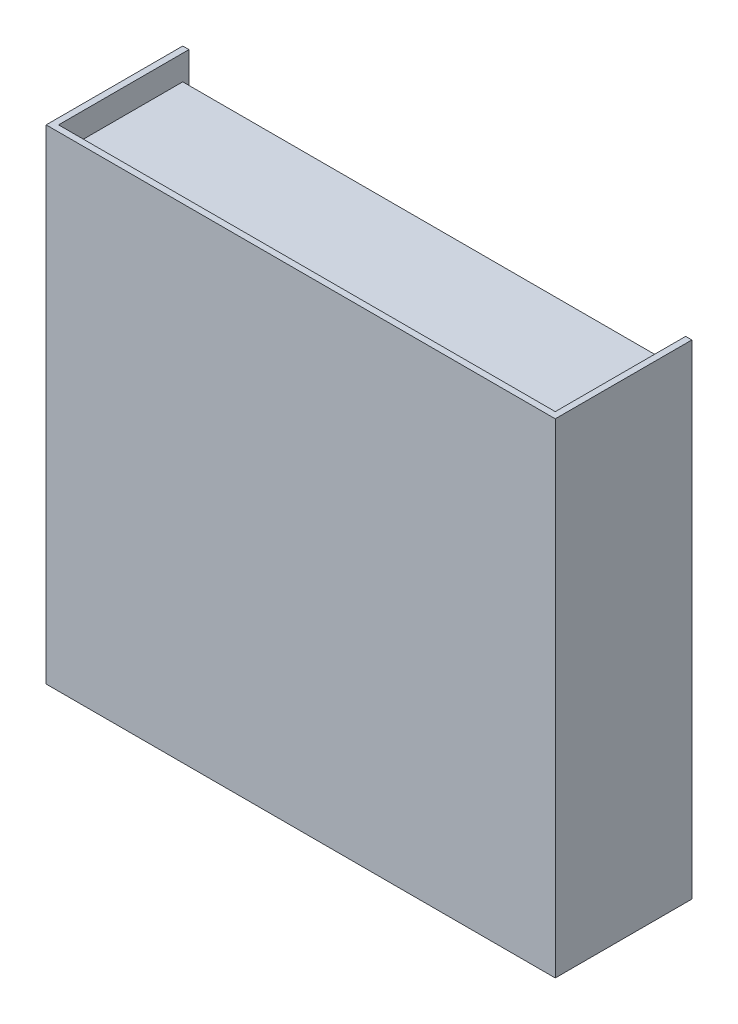
ISO-10303-21;
HEADER;
FILE_DESCRIPTION(('STEP AP214'),'2;1');
FILE_NAME('part.step','',(''),(''),'','','');
FILE_SCHEMA(('AUTOMOTIVE_DESIGN { 1 0 10303 214 1 1 1 1 }'));
ENDSEC;
DATA;
#1=APPLICATION_CONTEXT('core data for automotive mechanical design processes');
#2=APPLICATION_PROTOCOL_DEFINITION('international standard','automotive_design',2000,#1);
#3=PRODUCT_CONTEXT('',#1,'mechanical');
#4=PRODUCT('Part','Part','',(#3));
#5=PRODUCT_RELATED_PRODUCT_CATEGORY('part','',(#4));
#6=PRODUCT_DEFINITION_FORMATION('','',#4);
#7=PRODUCT_DEFINITION_CONTEXT('part definition',#1,'design');
#8=PRODUCT_DEFINITION('design','',#6,#7);
#9=PRODUCT_DEFINITION_SHAPE('','',#8);
#10=(LENGTH_UNIT() NAMED_UNIT(*) SI_UNIT(.MILLI.,.METRE.));
#11=(NAMED_UNIT(*) PLANE_ANGLE_UNIT() SI_UNIT($,.RADIAN.));
#12=(NAMED_UNIT(*) SI_UNIT($,.STERADIAN.) SOLID_ANGLE_UNIT());
#13=UNCERTAINTY_MEASURE_WITH_UNIT(LENGTH_MEASURE(1.E-05),#10,'distance_accuracy_value','');
#14=(GEOMETRIC_REPRESENTATION_CONTEXT(3) GLOBAL_UNCERTAINTY_ASSIGNED_CONTEXT((#13)) GLOBAL_UNIT_ASSIGNED_CONTEXT((#10,
#11,#12)) REPRESENTATION_CONTEXT('',''));
#15=CARTESIAN_POINT('',(0.,0.,0.));
#16=DIRECTION('',(0.,0.,1.));
#17=DIRECTION('',(1.,0.,0.));
#18=AXIS2_PLACEMENT_3D('',#15,#16,#17);
#19=CARTESIAN_POINT('',(-512.899336878687,-463.478806381637,203.2));
#20=DIRECTION('',(-1.,0.,0.));
#21=DIRECTION('',(0.,0.,1.));
#22=AXIS2_PLACEMENT_3D('',#19,#20,#21);
#23=PLANE('',#22);
#24=DIRECTION('',(0.,0.,-1.));
#25=VECTOR('',#24,1.);
#26=CARTESIAN_POINT('',(-512.899336878687,-387.278806381637,203.2));
#27=LINE('',#26,#25);
#28=CARTESIAN_POINT('',(-512.899336878687,-387.278806381637,203.2));
#29=VERTEX_POINT('',#28);
#30=CARTESIAN_POINT('',(-512.899336878687,-387.278806381637,63.5));
#31=VERTEX_POINT('',#30);
#32=EDGE_CURVE('E388',#29,#31,#27,.T.);
#33=ORIENTED_EDGE('',*,*,#32,.T.);
#34=DIRECTION('',(0.,1.,0.));
#35=VECTOR('',#34,1.);
#36=CARTESIAN_POINT('',(-512.899336878687,-399.978806381637,63.5));
#37=LINE('',#36,#35);
#38=CARTESIAN_POINT('',(-512.899336878687,-323.778806381637,63.5));
#39=VERTEX_POINT('',#38);
#40=EDGE_CURVE('E58',#31,#39,#37,.T.);
#41=ORIENTED_EDGE('',*,*,#40,.T.);
#42=DIRECTION('',(0.,0.,-1.));
#43=VECTOR('',#42,1.);
#44=CARTESIAN_POINT('',(-512.899336878687,-323.778806381637,63.5));
#45=LINE('',#44,#43);
#46=CARTESIAN_POINT('',(-512.899336878687,-323.778806381637,50.8));
#47=VERTEX_POINT('',#46);
#48=EDGE_CURVE('E471',#39,#47,#45,.T.);
#49=ORIENTED_EDGE('',*,*,#48,.T.);
#50=DIRECTION('',(0.,1.,0.));
#51=VECTOR('',#50,1.);
#52=CARTESIAN_POINT('',(-512.899336878687,-476.178806381637,50.8));
#53=LINE('',#52,#51);
#54=CARTESIAN_POINT('',(-512.899336878687,-399.978806381637,50.8));
#55=VERTEX_POINT('',#54);
#56=EDGE_CURVE('E66',#55,#47,#53,.T.);
#57=ORIENTED_EDGE('',*,*,#56,.F.);
#58=DIRECTION('',(0.,0.,-1.));
#59=VECTOR('',#58,1.);
#60=CARTESIAN_POINT('',(-512.899336878687,-399.978806381637,203.2));
#61=LINE('',#60,#59);
#62=CARTESIAN_POINT('',(-512.899336878687,-399.978806381637,203.2));
#63=VERTEX_POINT('',#62);
#64=EDGE_CURVE('E312',#63,#55,#61,.T.);
#65=ORIENTED_EDGE('',*,*,#64,.F.);
#66=DIRECTION('',(0.,1.,0.));
#67=VECTOR('',#66,1.);
#68=CARTESIAN_POINT('',(-512.899336878687,-476.178806381637,203.2));
#69=LINE('',#68,#67);
#70=CARTESIAN_POINT('',(-512.899336878687,-476.178806381637,203.2));
#71=VERTEX_POINT('',#70);
#72=EDGE_CURVE('E418',#71,#63,#69,.T.);
#73=ORIENTED_EDGE('',*,*,#72,.F.);
#74=DIRECTION('',(0.,0.,-1.));
#75=VECTOR('',#74,1.);
#76=CARTESIAN_POINT('',(-512.899336878687,-476.178806381637,203.2));
#77=LINE('',#76,#75);
#78=CARTESIAN_POINT('',(-512.899336878687,-476.178806381637,-50.8));
#79=VERTEX_POINT('',#78);
#80=EDGE_CURVE('E430',#71,#79,#77,.T.);
#81=ORIENTED_EDGE('',*,*,#80,.T.);
#82=DIRECTION('',(0.,-1.,0.));
#83=VECTOR('',#82,1.);
#84=CARTESIAN_POINT('',(-512.899336878687,463.621193618363,-50.8));
#85=LINE('',#84,#83);
#86=CARTESIAN_POINT('',(-512.899336878687,514.421193618363,-50.8));
#87=VERTEX_POINT('',#86);
#88=EDGE_CURVE('E328',#87,#79,#85,.T.);
#89=ORIENTED_EDGE('',*,*,#88,.F.);
#90=DIRECTION('',(0.,0.,-1.));
#91=VECTOR('',#90,1.);
#92=CARTESIAN_POINT('',(-512.899336878687,514.421193618363,0.));
#93=LINE('',#92,#91);
#94=CARTESIAN_POINT('',(-512.899336878687,514.421193618363,215.9));
#95=VERTEX_POINT('',#94);
#96=EDGE_CURVE('E275',#95,#87,#93,.T.);
#97=ORIENTED_EDGE('',*,*,#96,.F.);
#98=DIRECTION('',(0.,-1.,0.));
#99=VECTOR('',#98,1.);
#100=CARTESIAN_POINT('',(-512.899336878687,514.421193618363,215.9));
#101=LINE('',#100,#99);
#102=CARTESIAN_POINT('',(-512.899336878687,463.621193618363,215.9));
#103=VERTEX_POINT('',#102);
#104=EDGE_CURVE('E307',#95,#103,#101,.T.);
#105=ORIENTED_EDGE('',*,*,#104,.T.);
#106=DIRECTION('',(0.,0.,-1.));
#107=VECTOR('',#106,1.);
#108=CARTESIAN_POINT('',(-512.899336878687,463.621193618363,0.));
#109=LINE('',#108,#107);
#110=CARTESIAN_POINT('',(-512.899336878687,463.621193618363,-38.1));
#111=VERTEX_POINT('',#110);
#112=EDGE_CURVE('E280',#103,#111,#109,.T.);
#113=ORIENTED_EDGE('',*,*,#112,.T.);
#114=DIRECTION('',(0.,1.,0.));
#115=VECTOR('',#114,1.);
#116=CARTESIAN_POINT('',(-512.899336878687,463.621193618363,-38.1));
#117=LINE('',#116,#115);
#118=CARTESIAN_POINT('',(-512.899336878687,450.921193618363,-38.1));
#119=VERTEX_POINT('',#118);
#120=EDGE_CURVE('E255',#119,#111,#117,.T.);
#121=ORIENTED_EDGE('',*,*,#120,.F.);
#122=DIRECTION('',(0.,0.,-1.));
#123=VECTOR('',#122,1.);
#124=CARTESIAN_POINT('',(-512.899336878687,450.921193618363,203.2));
#125=LINE('',#124,#123);
#126=CARTESIAN_POINT('',(-512.899336878687,450.921193618363,203.2));
#127=VERTEX_POINT('',#126);
#128=EDGE_CURVE('E412',#127,#119,#125,.T.);
#129=ORIENTED_EDGE('',*,*,#128,.F.);
#130=DIRECTION('',(0.,-1.,0.));
#131=VECTOR('',#130,1.);
#132=CARTESIAN_POINT('',(-512.899336878687,38.1711936183629,203.2));
#133=LINE('',#132,#131);
#134=CARTESIAN_POINT('',(-512.899336878687,38.1711936183629,203.2));
#135=VERTEX_POINT('',#134);
#136=EDGE_CURVE('E399',#127,#135,#133,.T.);
#137=ORIENTED_EDGE('',*,*,#136,.T.);
#138=DIRECTION('',(0.,0.,-1.));
#139=VECTOR('',#138,1.);
#140=CARTESIAN_POINT('',(-512.899336878687,38.1711936183629,203.2));
#141=LINE('',#140,#139);
#142=CARTESIAN_POINT('',(-512.899336878687,38.1711936183629,63.5));
#143=VERTEX_POINT('',#142);
#144=EDGE_CURVE('E232',#135,#143,#141,.T.);
#145=ORIENTED_EDGE('',*,*,#144,.T.);
#146=DIRECTION('',(0.,1.,0.));
#147=VECTOR('',#146,1.);
#148=CARTESIAN_POINT('',(-512.899336878687,25.4711936183629,63.5));
#149=LINE('',#148,#147);
#150=CARTESIAN_POINT('',(-512.899336878687,101.671193618363,63.5));
#151=VERTEX_POINT('',#150);
#152=EDGE_CURVE('E223',#143,#151,#149,.T.);
#153=ORIENTED_EDGE('',*,*,#152,.T.);
#154=DIRECTION('',(0.,0.,-1.));
#155=VECTOR('',#154,1.);
#156=CARTESIAN_POINT('',(-512.899336878687,101.671193618363,63.5));
#157=LINE('',#156,#155);
#158=CARTESIAN_POINT('',(-512.899336878687,101.671193618363,50.8));
#159=VERTEX_POINT('',#158);
#160=EDGE_CURVE('E208',#151,#159,#157,.T.);
#161=ORIENTED_EDGE('',*,*,#160,.T.);
#162=CARTESIAN_POINT('',(-512.899336878687,25.471193618363,50.8));
#163=VERTEX_POINT('',#162);
#164=EDGE_CURVE('E263',#163,#159,#53,.T.);
#165=ORIENTED_EDGE('',*,*,#164,.F.);
#166=DIRECTION('',(0.,0.,-1.));
#167=VECTOR('',#166,1.);
#168=CARTESIAN_POINT('',(-512.899336878687,25.4711936183629,203.2));
#169=LINE('',#168,#167);
#170=CARTESIAN_POINT('',(-512.899336878687,25.4711936183629,203.2));
#171=VERTEX_POINT('',#170);
#172=EDGE_CURVE('E378',#171,#163,#169,.T.);
#173=ORIENTED_EDGE('',*,*,#172,.F.);
#174=DIRECTION('',(0.,-1.,0.));
#175=VECTOR('',#174,1.);
#176=CARTESIAN_POINT('',(-512.899336878687,-387.278806381637,203.2));
#177=LINE('',#176,#175);
#178=EDGE_CURVE('E359',#171,#29,#177,.T.);
#179=ORIENTED_EDGE('',*,*,#178,.T.);
#180=EDGE_LOOP('',(#33,#41,#49,#57,#65,#73,#81,#89,#97,#105,#113,#121,#129,#137,#145,#153,#161,
#165,#173,#179));
#181=FACE_BOUND('',#180,.T.);
#182=ADVANCED_FACE('F43',(#181),#23,.F.);
#183=CARTESIAN_POINT('',(503.100663121313,-463.478806381637,203.2));
#184=DIRECTION('',(1.,0.,0.));
#185=DIRECTION('',(0.,0.,-1.));
#186=AXIS2_PLACEMENT_3D('',#183,#184,#185);
#187=PLANE('',#186);
#188=DIRECTION('',(0.,0.,-1.));
#189=VECTOR('',#188,1.);
#190=CARTESIAN_POINT('',(503.100663121313,-323.778806381637,63.5));
#191=LINE('',#190,#189);
#192=CARTESIAN_POINT('',(503.100663121313,-323.778806381637,63.5));
#193=VERTEX_POINT('',#192);
#194=CARTESIAN_POINT('',(503.100663121313,-323.778806381637,50.8));
#195=VERTEX_POINT('',#194);
#196=EDGE_CURVE('E476',#193,#195,#191,.T.);
#197=ORIENTED_EDGE('',*,*,#196,.F.);
#198=DIRECTION('',(0.,-1.,0.));
#199=VECTOR('',#198,1.);
#200=CARTESIAN_POINT('',(503.100663121313,-399.978806381637,63.5));
#201=LINE('',#200,#199);
#202=CARTESIAN_POINT('',(503.100663121313,-387.278806381637,63.5));
#203=VERTEX_POINT('',#202);
#204=EDGE_CURVE('E464',#193,#203,#201,.T.);
#205=ORIENTED_EDGE('',*,*,#204,.T.);
#206=DIRECTION('',(0.,0.,-1.));
#207=VECTOR('',#206,1.);
#208=CARTESIAN_POINT('',(503.100663121313,-387.278806381637,203.2));
#209=LINE('',#208,#207);
#210=CARTESIAN_POINT('',(503.100663121313,-387.278806381637,203.2));
#211=VERTEX_POINT('',#210);
#212=EDGE_CURVE('E384',#211,#203,#209,.T.);
#213=ORIENTED_EDGE('',*,*,#212,.F.);
#214=DIRECTION('',(0.,1.,0.));
#215=VECTOR('',#214,1.);
#216=CARTESIAN_POINT('',(503.100663121313,-387.278806381637,203.2));
#217=LINE('',#216,#215);
#218=CARTESIAN_POINT('',(503.100663121313,25.4711936183629,203.2));
#219=VERTEX_POINT('',#218);
#220=EDGE_CURVE('E370',#211,#219,#217,.T.);
#221=ORIENTED_EDGE('',*,*,#220,.T.);
#222=DIRECTION('',(0.,0.,-1.));
#223=VECTOR('',#222,1.);
#224=CARTESIAN_POINT('',(503.100663121313,25.4711936183629,203.2));
#225=LINE('',#224,#223);
#226=CARTESIAN_POINT('',(503.100663121313,25.4711936183629,50.8));
#227=VERTEX_POINT('',#226);
#228=EDGE_CURVE('E381',#219,#227,#225,.T.);
#229=ORIENTED_EDGE('',*,*,#228,.T.);
#230=DIRECTION('',(0.,-1.,0.));
#231=VECTOR('',#230,1.);
#232=CARTESIAN_POINT('',(503.100663121313,-476.178806381637,50.8));
#233=LINE('',#232,#231);
#234=CARTESIAN_POINT('',(503.100663121313,101.671193618363,50.8));
#235=VERTEX_POINT('',#234);
#236=EDGE_CURVE('E266',#235,#227,#233,.T.);
#237=ORIENTED_EDGE('',*,*,#236,.F.);
#238=DIRECTION('',(0.,0.,-1.));
#239=VECTOR('',#238,1.);
#240=CARTESIAN_POINT('',(503.100663121313,101.671193618363,63.5));
#241=LINE('',#240,#239);
#242=CARTESIAN_POINT('',(503.100663121313,101.671193618363,63.5));
#243=VERTEX_POINT('',#242);
#244=EDGE_CURVE('E219',#243,#235,#241,.T.);
#245=ORIENTED_EDGE('',*,*,#244,.F.);
#246=DIRECTION('',(0.,-1.,0.));
#247=VECTOR('',#246,1.);
#248=CARTESIAN_POINT('',(503.100663121313,25.4711936183629,63.5));
#249=LINE('',#248,#247);
#250=CARTESIAN_POINT('',(503.100663121313,38.1711936183629,63.5));
#251=VERTEX_POINT('',#250);
#252=EDGE_CURVE('E226',#243,#251,#249,.T.);
#253=ORIENTED_EDGE('',*,*,#252,.T.);
#254=DIRECTION('',(0.,0.,-1.));
#255=VECTOR('',#254,1.);
#256=CARTESIAN_POINT('',(503.100663121313,38.1711936183629,203.2));
#257=LINE('',#256,#255);
#258=CARTESIAN_POINT('',(503.100663121313,38.1711936183629,203.2));
#259=VERTEX_POINT('',#258);
#260=EDGE_CURVE('E406',#259,#251,#257,.T.);
#261=ORIENTED_EDGE('',*,*,#260,.F.);
#262=DIRECTION('',(0.,1.,0.));
#263=VECTOR('',#262,1.);
#264=CARTESIAN_POINT('',(503.100663121313,38.1711936183629,203.2));
#265=LINE('',#264,#263);
#266=CARTESIAN_POINT('',(503.100663121313,450.921193618363,203.2));
#267=VERTEX_POINT('',#266);
#268=EDGE_CURVE('E391',#259,#267,#265,.T.);
#269=ORIENTED_EDGE('',*,*,#268,.T.);
#270=DIRECTION('',(0.,0.,-1.));
#271=VECTOR('',#270,1.);
#272=CARTESIAN_POINT('',(503.100663121313,450.921193618363,203.2));
#273=LINE('',#272,#271);
#274=CARTESIAN_POINT('',(503.100663121313,450.921193618363,-38.1));
#275=VERTEX_POINT('',#274);
#276=EDGE_CURVE('E415',#267,#275,#273,.T.);
#277=ORIENTED_EDGE('',*,*,#276,.T.);
#278=DIRECTION('',(0.,-1.,0.));
#279=VECTOR('',#278,1.);
#280=CARTESIAN_POINT('',(503.100663121313,463.621193618363,-38.1));
#281=LINE('',#280,#279);
#282=CARTESIAN_POINT('',(503.100663121313,463.621193618363,-38.1));
#283=VERTEX_POINT('',#282);
#284=EDGE_CURVE('E247',#283,#275,#281,.T.);
#285=ORIENTED_EDGE('',*,*,#284,.F.);
#286=DIRECTION('',(0.,0.,1.));
#287=VECTOR('',#286,1.);
#288=CARTESIAN_POINT('',(503.100663121313,463.621193618363,0.));
#289=LINE('',#288,#287);
#290=CARTESIAN_POINT('',(503.100663121313,463.621193618363,215.9));
#291=VERTEX_POINT('',#290);
#292=EDGE_CURVE('E308',#283,#291,#289,.T.);
#293=ORIENTED_EDGE('',*,*,#292,.T.);
#294=DIRECTION('',(0.,-1.,0.));
#295=VECTOR('',#294,1.);
#296=CARTESIAN_POINT('',(503.100663121313,514.421193618363,215.9));
#297=LINE('',#296,#295);
#298=CARTESIAN_POINT('',(503.100663121313,514.421193618363,215.9));
#299=VERTEX_POINT('',#298);
#300=EDGE_CURVE('E321',#299,#291,#297,.T.);
#301=ORIENTED_EDGE('',*,*,#300,.F.);
#302=DIRECTION('',(0.,0.,1.));
#303=VECTOR('',#302,1.);
#304=CARTESIAN_POINT('',(503.100663121313,514.421193618363,-50.8));
#305=LINE('',#304,#303);
#306=CARTESIAN_POINT('',(503.100663121313,514.421193618363,-50.8));
#307=VERTEX_POINT('',#306);
#308=EDGE_CURVE('E300',#307,#299,#305,.T.);
#309=ORIENTED_EDGE('',*,*,#308,.F.);
#310=DIRECTION('',(0.,1.,0.));
#311=VECTOR('',#310,1.);
#312=CARTESIAN_POINT('',(503.100663121313,463.621193618363,-50.8));
#313=LINE('',#312,#311);
#314=CARTESIAN_POINT('',(503.100663121313,-476.178806381637,-50.8));
#315=VERTEX_POINT('',#314);
#316=EDGE_CURVE('E344',#315,#307,#313,.T.);
#317=ORIENTED_EDGE('',*,*,#316,.F.);
#318=DIRECTION('',(0.,0.,-1.));
#319=VECTOR('',#318,1.);
#320=CARTESIAN_POINT('',(503.100663121313,-476.178806381637,203.2));
#321=LINE('',#320,#319);
#322=CARTESIAN_POINT('',(503.100663121313,-476.178806381637,203.2));
#323=VERTEX_POINT('',#322);
#324=EDGE_CURVE('E439',#323,#315,#321,.T.);
#325=ORIENTED_EDGE('',*,*,#324,.F.);
#326=DIRECTION('',(0.,-1.,0.));
#327=VECTOR('',#326,1.);
#328=CARTESIAN_POINT('',(503.100663121313,-463.478806381637,203.2));
#329=LINE('',#328,#327);
#330=CARTESIAN_POINT('',(503.100663121313,-399.978806381637,203.2));
#331=VERTEX_POINT('',#330);
#332=EDGE_CURVE('E426',#331,#323,#329,.T.);
#333=ORIENTED_EDGE('',*,*,#332,.F.);
#334=DIRECTION('',(0.,0.,-1.));
#335=VECTOR('',#334,1.);
#336=CARTESIAN_POINT('',(503.100663121313,-399.978806381637,203.2));
#337=LINE('',#336,#335);
#338=CARTESIAN_POINT('',(503.100663121313,-399.978806381637,50.8));
#339=VERTEX_POINT('',#338);
#340=EDGE_CURVE('E442',#331,#339,#337,.T.);
#341=ORIENTED_EDGE('',*,*,#340,.T.);
#342=EDGE_CURVE('E271',#195,#339,#233,.T.);
#343=ORIENTED_EDGE('',*,*,#342,.F.);
#344=EDGE_LOOP('',(#197,#205,#213,#221,#229,#237,#245,#253,#261,#269,#277,#285,#293,#301,#309,
#317,#325,#333,#341,#343));
#345=FACE_BOUND('',#344,.T.);
#346=ADVANCED_FACE('F523',(#345),#187,.F.);
#347=CARTESIAN_POINT('',(-512.899336878687,-399.978806381637,203.2));
#348=DIRECTION('',(0.,1.,0.));
#349=DIRECTION('',(0.,0.,1.));
#350=AXIS2_PLACEMENT_3D('',#347,#348,#349);
#351=PLANE('',#350);
#352=ORIENTED_EDGE('',*,*,#64,.T.);
#353=DIRECTION('',(-1.,0.,0.));
#354=VECTOR('',#353,1.);
#355=CARTESIAN_POINT('',(-512.899336878687,-399.978806381637,50.8));
#356=LINE('',#355,#354);
#357=EDGE_CURVE('E270',#339,#55,#356,.T.);
#358=ORIENTED_EDGE('',*,*,#357,.F.);
#359=ORIENTED_EDGE('',*,*,#340,.F.);
#360=DIRECTION('',(1.,0.,0.));
#361=VECTOR('',#360,1.);
#362=CARTESIAN_POINT('',(-512.899336878687,-399.978806381637,203.2));
#363=LINE('',#362,#361);
#364=EDGE_CURVE('E422',#63,#331,#363,.T.);
#365=ORIENTED_EDGE('',*,*,#364,.F.);
#366=EDGE_LOOP('',(#352,#358,#359,#365));
#367=FACE_BOUND('',#366,.T.);
#368=ADVANCED_FACE('F490',(#367),#351,.F.);
#369=CARTESIAN_POINT('',(-512.899336878687,38.1711936183629,203.2));
#370=DIRECTION('',(0.,1.,0.));
#371=DIRECTION('',(0.,0.,1.));
#372=AXIS2_PLACEMENT_3D('',#369,#370,#371);
#373=PLANE('',#372);
#374=DIRECTION('',(1.,0.,0.));
#375=VECTOR('',#374,1.);
#376=CARTESIAN_POINT('',(-512.899336878687,38.1711936183629,63.5));
#377=LINE('',#376,#375);
#378=EDGE_CURVE('E243',#143,#251,#377,.T.);
#379=ORIENTED_EDGE('',*,*,#378,.F.);
#380=ORIENTED_EDGE('',*,*,#144,.F.);
#381=DIRECTION('',(1.,0.,0.));
#382=VECTOR('',#381,1.);
#383=CARTESIAN_POINT('',(-512.899336878687,38.1711936183629,203.2));
#384=LINE('',#383,#382);
#385=EDGE_CURVE('E402',#135,#259,#384,.T.);
#386=ORIENTED_EDGE('',*,*,#385,.T.);
#387=ORIENTED_EDGE('',*,*,#260,.T.);
#388=EDGE_LOOP('',(#379,#380,#386,#387));
#389=FACE_BOUND('',#388,.T.);
#390=ADVANCED_FACE('F545',(#389),#373,.T.);
#391=CARTESIAN_POINT('',(-512.899336878687,-387.278806381637,203.2));
#392=DIRECTION('',(0.,1.,0.));
#393=DIRECTION('',(0.,0.,1.));
#394=AXIS2_PLACEMENT_3D('',#391,#392,#393);
#395=PLANE('',#394);
#396=DIRECTION('',(1.,0.,0.));
#397=VECTOR('',#396,1.);
#398=CARTESIAN_POINT('',(-512.899336878687,-387.278806381637,63.5));
#399=LINE('',#398,#397);
#400=EDGE_CURVE('E11',#31,#203,#399,.T.);
#401=ORIENTED_EDGE('',*,*,#400,.F.);
#402=ORIENTED_EDGE('',*,*,#32,.F.);
#403=DIRECTION('',(1.,0.,0.));
#404=VECTOR('',#403,1.);
#405=CARTESIAN_POINT('',(-512.899336878687,-387.278806381637,203.2));
#406=LINE('',#405,#404);
#407=EDGE_CURVE('E366',#29,#211,#406,.T.);
#408=ORIENTED_EDGE('',*,*,#407,.T.);
#409=ORIENTED_EDGE('',*,*,#212,.T.);
#410=EDGE_LOOP('',(#401,#402,#408,#409));
#411=FACE_BOUND('',#410,.T.);
#412=ADVANCED_FACE('F458',(#411),#395,.T.);
#413=CARTESIAN_POINT('',(-512.899336878687,25.4711936183629,203.2));
#414=DIRECTION('',(0.,-1.,0.));
#415=DIRECTION('',(0.,0.,-1.));
#416=AXIS2_PLACEMENT_3D('',#413,#414,#415);
#417=PLANE('',#416);
#418=ORIENTED_EDGE('',*,*,#172,.T.);
#419=DIRECTION('',(1.,0.,0.));
#420=VECTOR('',#419,1.);
#421=CARTESIAN_POINT('',(-512.899336878687,25.4711936183629,50.8));
#422=LINE('',#421,#420);
#423=EDGE_CURVE('E51',#163,#227,#422,.T.);
#424=ORIENTED_EDGE('',*,*,#423,.T.);
#425=ORIENTED_EDGE('',*,*,#228,.F.);
#426=DIRECTION('',(-1.,0.,0.));
#427=VECTOR('',#426,1.);
#428=CARTESIAN_POINT('',(-512.899336878687,25.4711936183629,203.2));
#429=LINE('',#428,#427);
#430=EDGE_CURVE('E374',#219,#171,#429,.T.);
#431=ORIENTED_EDGE('',*,*,#430,.T.);
#432=EDGE_LOOP('',(#418,#424,#425,#431));
#433=FACE_BOUND('',#432,.T.);
#434=ADVANCED_FACE('F451',(#433),#417,.T.);
#435=CARTESIAN_POINT('',(-525.599336878687,463.621193618363,203.2));
#436=DIRECTION('',(0.,-1.,0.));
#437=DIRECTION('',(0.,0.,-1.));
#438=AXIS2_PLACEMENT_3D('',#435,#436,#437);
#439=PLANE('',#438);
#440=ORIENTED_EDGE('',*,*,#112,.F.);
#441=DIRECTION('',(-1.,0.,0.));
#442=VECTOR('',#441,1.);
#443=CARTESIAN_POINT('',(-512.899336878687,463.621193618363,215.9));
#444=LINE('',#443,#442);
#445=EDGE_CURVE('E274',#291,#103,#444,.T.);
#446=ORIENTED_EDGE('',*,*,#445,.F.);
#447=ORIENTED_EDGE('',*,*,#292,.F.);
#448=DIRECTION('',(1.,0.,0.));
#449=VECTOR('',#448,1.);
#450=CARTESIAN_POINT('',(503.100663121313,463.621193618363,-38.1));
#451=LINE('',#450,#449);
#452=EDGE_CURVE('E259',#111,#283,#451,.T.);
#453=ORIENTED_EDGE('',*,*,#452,.F.);
#454=EDGE_LOOP('',(#440,#446,#447,#453));
#455=FACE_BOUND('',#454,.T.);
#456=ADVANCED_FACE('F536',(#455),#439,.F.);
#457=CARTESIAN_POINT('',(515.800663121313,-476.178806381637,203.2));
#458=DIRECTION('',(-1.,0.,0.));
#459=DIRECTION('',(0.,0.,1.));
#460=AXIS2_PLACEMENT_3D('',#457,#458,#459);
#461=PLANE('',#460);
#462=DIRECTION('',(0.,0.,-1.));
#463=VECTOR('',#462,1.);
#464=CARTESIAN_POINT('',(515.800663121313,-476.178806381637,203.2));
#465=LINE('',#464,#463);
#466=CARTESIAN_POINT('',(515.800663121313,-476.178806381637,228.6));
#467=VERTEX_POINT('',#466);
#468=CARTESIAN_POINT('',(515.800663121313,-476.178806381637,-50.8));
#469=VERTEX_POINT('',#468);
#470=EDGE_CURVE('E436',#467,#469,#465,.T.);
#471=ORIENTED_EDGE('',*,*,#470,.T.);
#472=DIRECTION('',(0.,-1.,0.));
#473=VECTOR('',#472,1.);
#474=CARTESIAN_POINT('',(515.800663121313,463.621193618363,-50.8));
#475=LINE('',#474,#473);
#476=CARTESIAN_POINT('',(515.800663121313,514.421193618363,-50.8));
#477=VERTEX_POINT('',#476);
#478=EDGE_CURVE('E336',#477,#469,#475,.T.);
#479=ORIENTED_EDGE('',*,*,#478,.F.);
#480=DIRECTION('',(0.,0.,-1.));
#481=VECTOR('',#480,1.);
#482=CARTESIAN_POINT('',(515.800663121313,514.421193618363,228.6));
#483=LINE('',#482,#481);
#484=CARTESIAN_POINT('',(515.800663121313,514.421193618363,228.6));
#485=VERTEX_POINT('',#484);
#486=EDGE_CURVE('E292',#485,#477,#483,.T.);
#487=ORIENTED_EDGE('',*,*,#486,.F.);
#488=DIRECTION('',(0.,1.,0.));
#489=VECTOR('',#488,1.);
#490=CARTESIAN_POINT('',(515.800663121313,463.621193618363,228.6));
#491=LINE('',#490,#489);
#492=EDGE_CURVE('E356',#467,#485,#491,.T.);
#493=ORIENTED_EDGE('',*,*,#492,.F.);
#494=EDGE_LOOP('',(#471,#479,#487,#493));
#495=FACE_BOUND('',#494,.T.);
#496=ADVANCED_FACE('F517',(#495),#461,.F.);
#497=CARTESIAN_POINT('',(-525.599336878687,-476.178806381637,203.2));
#498=DIRECTION('',(1.,0.,0.));
#499=DIRECTION('',(0.,0.,-1.));
#500=AXIS2_PLACEMENT_3D('',#497,#498,#499);
#501=PLANE('',#500);
#502=DIRECTION('',(0.,-1.,0.));
#503=VECTOR('',#502,1.);
#504=CARTESIAN_POINT('',(-525.599336878687,463.621193618363,228.6));
#505=LINE('',#504,#503);
#506=CARTESIAN_POINT('',(-525.599336878687,514.421193618363,228.6));
#507=VERTEX_POINT('',#506);
#508=CARTESIAN_POINT('',(-525.599336878687,-476.178806381637,228.6));
#509=VERTEX_POINT('',#508);
#510=EDGE_CURVE('E348',#507,#509,#505,.T.);
#511=ORIENTED_EDGE('',*,*,#510,.F.);
#512=DIRECTION('',(0.,0.,1.));
#513=VECTOR('',#512,1.);
#514=CARTESIAN_POINT('',(-525.599336878687,514.421193618363,-50.8));
#515=LINE('',#514,#513);
#516=CARTESIAN_POINT('',(-525.599336878687,514.421193618363,-50.8));
#517=VERTEX_POINT('',#516);
#518=EDGE_CURVE('E284',#517,#507,#515,.T.);
#519=ORIENTED_EDGE('',*,*,#518,.F.);
#520=DIRECTION('',(0.,1.,0.));
#521=VECTOR('',#520,1.);
#522=CARTESIAN_POINT('',(-525.599336878687,463.621193618363,-50.8));
#523=LINE('',#522,#521);
#524=CARTESIAN_POINT('',(-525.599336878687,-476.178806381637,-50.8));
#525=VERTEX_POINT('',#524);
#526=EDGE_CURVE('E325',#525,#517,#523,.T.);
#527=ORIENTED_EDGE('',*,*,#526,.F.);
#528=DIRECTION('',(0.,0.,-1.));
#529=VECTOR('',#528,1.);
#530=CARTESIAN_POINT('',(-525.599336878687,-476.178806381637,203.2));
#531=LINE('',#530,#529);
#532=EDGE_CURVE('E433',#509,#525,#531,.T.);
#533=ORIENTED_EDGE('',*,*,#532,.F.);
#534=EDGE_LOOP('',(#511,#519,#527,#533));
#535=FACE_BOUND('',#534,.T.);
#536=ADVANCED_FACE('F508',(#535),#501,.F.);
#537=CARTESIAN_POINT('',(-525.599336878687,-476.178806381637,203.2));
#538=DIRECTION('',(0.,1.,0.));
#539=DIRECTION('',(0.,0.,1.));
#540=AXIS2_PLACEMENT_3D('',#537,#538,#539);
#541=PLANE('',#540);
#542=ORIENTED_EDGE('',*,*,#532,.T.);
#543=DIRECTION('',(-1.,0.,0.));
#544=VECTOR('',#543,1.);
#545=CARTESIAN_POINT('',(-525.599336878687,-476.178806381637,-50.8));
#546=LINE('',#545,#544);
#547=EDGE_CURVE('E332',#79,#525,#546,.T.);
#548=ORIENTED_EDGE('',*,*,#547,.F.);
#549=ORIENTED_EDGE('',*,*,#80,.F.);
#550=DIRECTION('',(1.,0.,0.));
#551=VECTOR('',#550,1.);
#552=CARTESIAN_POINT('',(-525.599336878687,-476.178806381637,203.2));
#553=LINE('',#552,#551);
#554=EDGE_CURVE('E347',#71,#323,#553,.T.);
#555=ORIENTED_EDGE('',*,*,#554,.T.);
#556=ORIENTED_EDGE('',*,*,#324,.T.);
#557=DIRECTION('',(-1.,0.,0.));
#558=VECTOR('',#557,1.);
#559=CARTESIAN_POINT('',(515.800663121313,-476.178806381637,-50.8));
#560=LINE('',#559,#558);
#561=EDGE_CURVE('E340',#469,#315,#560,.T.);
#562=ORIENTED_EDGE('',*,*,#561,.F.);
#563=ORIENTED_EDGE('',*,*,#470,.F.);
#564=DIRECTION('',(1.,0.,0.));
#565=VECTOR('',#564,1.);
#566=CARTESIAN_POINT('',(-525.599336878687,-476.178806381637,228.6));
#567=LINE('',#566,#565);
#568=EDGE_CURVE('E352',#509,#467,#567,.T.);
#569=ORIENTED_EDGE('',*,*,#568,.F.);
#570=EDGE_LOOP('',(#542,#548,#549,#555,#556,#562,#563,#569));
#571=FACE_BOUND('',#570,.T.);
#572=ADVANCED_FACE('F498',(#571),#541,.F.);
#573=CARTESIAN_POINT('',(-512.899336878687,450.921193618363,203.2));
#574=DIRECTION('',(0.,-1.,0.));
#575=DIRECTION('',(0.,0.,-1.));
#576=AXIS2_PLACEMENT_3D('',#573,#574,#575);
#577=PLANE('',#576);
#578=ORIENTED_EDGE('',*,*,#128,.T.);
#579=DIRECTION('',(-1.,0.,0.));
#580=VECTOR('',#579,1.);
#581=CARTESIAN_POINT('',(503.100663121313,450.921193618363,-38.1));
#582=LINE('',#581,#580);
#583=EDGE_CURVE('E251',#275,#119,#582,.T.);
#584=ORIENTED_EDGE('',*,*,#583,.F.);
#585=ORIENTED_EDGE('',*,*,#276,.F.);
#586=DIRECTION('',(-1.,0.,0.));
#587=VECTOR('',#586,1.);
#588=CARTESIAN_POINT('',(-512.899336878687,450.921193618363,203.2));
#589=LINE('',#588,#587);
#590=EDGE_CURVE('E395',#267,#127,#589,.T.);
#591=ORIENTED_EDGE('',*,*,#590,.T.);
#592=EDGE_LOOP('',(#578,#584,#585,#591));
#593=FACE_BOUND('',#592,.T.);
#594=ADVANCED_FACE('F541',(#593),#577,.T.);
#595=CARTESIAN_POINT('',(0.,0.,203.2));
#596=DIRECTION('',(0.,0.,1.));
#597=DIRECTION('',(1.,0.,0.));
#598=AXIS2_PLACEMENT_3D('',#595,#596,#597);
#599=PLANE('',#598);
#600=ORIENTED_EDGE('',*,*,#178,.F.);
#601=ORIENTED_EDGE('',*,*,#430,.F.);
#602=ORIENTED_EDGE('',*,*,#220,.F.);
#603=ORIENTED_EDGE('',*,*,#407,.F.);
#604=EDGE_LOOP('',(#600,#601,#602,#603));
#605=FACE_BOUND('',#604,.T.);
#606=ADVANCED_FACE('F546',(#605),#599,.F.);
#607=CARTESIAN_POINT('',(0.,0.,228.6));
#608=DIRECTION('',(0.,0.,1.));
#609=DIRECTION('',(1.,0.,0.));
#610=AXIS2_PLACEMENT_3D('',#607,#608,#609);
#611=PLANE('',#610);
#612=ORIENTED_EDGE('',*,*,#510,.T.);
#613=ORIENTED_EDGE('',*,*,#568,.T.);
#614=ORIENTED_EDGE('',*,*,#492,.T.);
#615=DIRECTION('',(1.,0.,0.));
#616=VECTOR('',#615,1.);
#617=CARTESIAN_POINT('',(515.800663121313,514.421193618363,228.6));
#618=LINE('',#617,#616);
#619=EDGE_CURVE('E288',#507,#485,#618,.T.);
#620=ORIENTED_EDGE('',*,*,#619,.F.);
#621=EDGE_LOOP('',(#612,#613,#614,#620));
#622=FACE_BOUND('',#621,.T.);
#623=ADVANCED_FACE('F514',(#622),#611,.T.);
#624=ORIENTED_EDGE('',*,*,#554,.F.);
#625=ORIENTED_EDGE('',*,*,#72,.T.);
#626=ORIENTED_EDGE('',*,*,#364,.T.);
#627=ORIENTED_EDGE('',*,*,#332,.T.);
#628=EDGE_LOOP('',(#624,#625,#626,#627));
#629=FACE_BOUND('',#628,.T.);
#630=ADVANCED_FACE('F496',(#629),#599,.F.);
#631=ORIENTED_EDGE('',*,*,#268,.F.);
#632=ORIENTED_EDGE('',*,*,#385,.F.);
#633=ORIENTED_EDGE('',*,*,#136,.F.);
#634=ORIENTED_EDGE('',*,*,#590,.F.);
#635=EDGE_LOOP('',(#631,#632,#633,#634));
#636=FACE_BOUND('',#635,.T.);
#637=ADVANCED_FACE('F543',(#636),#599,.F.);
#638=CARTESIAN_POINT('',(0.,0.,-50.8));
#639=DIRECTION('',(0.,0.,-1.));
#640=DIRECTION('',(-1.,0.,0.));
#641=AXIS2_PLACEMENT_3D('',#638,#639,#640);
#642=PLANE('',#641);
#643=ORIENTED_EDGE('',*,*,#478,.T.);
#644=ORIENTED_EDGE('',*,*,#561,.T.);
#645=ORIENTED_EDGE('',*,*,#316,.T.);
#646=DIRECTION('',(-1.,0.,0.));
#647=VECTOR('',#646,1.);
#648=CARTESIAN_POINT('',(515.800663121313,514.421193618363,-50.8));
#649=LINE('',#648,#647);
#650=EDGE_CURVE('E296',#477,#307,#649,.T.);
#651=ORIENTED_EDGE('',*,*,#650,.F.);
#652=EDGE_LOOP('',(#643,#644,#645,#651));
#653=FACE_BOUND('',#652,.T.);
#654=ADVANCED_FACE('F521',(#653),#642,.T.);
#655=CARTESIAN_POINT('',(0.,0.,-50.8));
#656=DIRECTION('',(0.,0.,1.));
#657=DIRECTION('',(1.,0.,0.));
#658=AXIS2_PLACEMENT_3D('',#655,#656,#657);
#659=PLANE('',#658);
#660=ORIENTED_EDGE('',*,*,#526,.T.);
#661=DIRECTION('',(-1.,0.,0.));
#662=VECTOR('',#661,1.);
#663=CARTESIAN_POINT('',(-512.899336878687,514.421193618363,-50.8));
#664=LINE('',#663,#662);
#665=EDGE_CURVE('E279',#87,#517,#664,.T.);
#666=ORIENTED_EDGE('',*,*,#665,.F.);
#667=ORIENTED_EDGE('',*,*,#88,.T.);
#668=ORIENTED_EDGE('',*,*,#547,.T.);
#669=EDGE_LOOP('',(#660,#666,#667,#668));
#670=FACE_BOUND('',#669,.T.);
#671=ADVANCED_FACE('F504',(#670),#659,.F.);
#672=CARTESIAN_POINT('',(-512.899336878687,514.421193618363,215.9));
#673=DIRECTION('',(0.,0.,1.));
#674=DIRECTION('',(1.,0.,0.));
#675=AXIS2_PLACEMENT_3D('',#672,#673,#674);
#676=PLANE('',#675);
#677=ORIENTED_EDGE('',*,*,#445,.T.);
#678=ORIENTED_EDGE('',*,*,#104,.F.);
#679=DIRECTION('',(-1.,0.,0.));
#680=VECTOR('',#679,1.);
#681=CARTESIAN_POINT('',(-512.899336878687,514.421193618363,215.9));
#682=LINE('',#681,#680);
#683=EDGE_CURVE('E303',#299,#95,#682,.T.);
#684=ORIENTED_EDGE('',*,*,#683,.F.);
#685=ORIENTED_EDGE('',*,*,#300,.T.);
#686=EDGE_LOOP('',(#677,#678,#684,#685));
#687=FACE_BOUND('',#686,.T.);
#688=ADVANCED_FACE('F528',(#687),#676,.F.);
#689=CARTESIAN_POINT('',(0.,514.421193618363,0.));
#690=DIRECTION('',(0.,1.,0.));
#691=DIRECTION('',(0.,0.,1.));
#692=AXIS2_PLACEMENT_3D('',#689,#690,#691);
#693=PLANE('',#692);
#694=ORIENTED_EDGE('',*,*,#96,.T.);
#695=ORIENTED_EDGE('',*,*,#665,.T.);
#696=ORIENTED_EDGE('',*,*,#518,.T.);
#697=ORIENTED_EDGE('',*,*,#619,.T.);
#698=ORIENTED_EDGE('',*,*,#486,.T.);
#699=ORIENTED_EDGE('',*,*,#650,.T.);
#700=ORIENTED_EDGE('',*,*,#308,.T.);
#701=ORIENTED_EDGE('',*,*,#683,.T.);
#702=EDGE_LOOP('',(#694,#695,#696,#697,#698,#699,#700,#701));
#703=FACE_BOUND('',#702,.T.);
#704=ADVANCED_FACE('F511',(#703),#693,.T.);
#705=CARTESIAN_POINT('',(0.,0.,50.8));
#706=DIRECTION('',(0.,0.,-1.));
#707=DIRECTION('',(-1.,0.,0.));
#708=AXIS2_PLACEMENT_3D('',#705,#706,#707);
#709=PLANE('',#708);
#710=ORIENTED_EDGE('',*,*,#164,.T.);
#711=DIRECTION('',(1.,0.,0.));
#712=VECTOR('',#711,1.);
#713=CARTESIAN_POINT('',(503.100663121313,101.671193618363,50.8));
#714=LINE('',#713,#712);
#715=EDGE_CURVE('E215',#159,#235,#714,.T.);
#716=ORIENTED_EDGE('',*,*,#715,.T.);
#717=ORIENTED_EDGE('',*,*,#236,.T.);
#718=ORIENTED_EDGE('',*,*,#423,.F.);
#719=EDGE_LOOP('',(#710,#716,#717,#718));
#720=FACE_BOUND('',#719,.T.);
#721=ADVANCED_FACE('F454',(#720),#709,.T.);
#722=ORIENTED_EDGE('',*,*,#357,.T.);
#723=ORIENTED_EDGE('',*,*,#56,.T.);
#724=DIRECTION('',(1.,0.,0.));
#725=VECTOR('',#724,1.);
#726=CARTESIAN_POINT('',(503.100663121313,-323.778806381637,50.8));
#727=LINE('',#726,#725);
#728=EDGE_CURVE('E241',#47,#195,#727,.T.);
#729=ORIENTED_EDGE('',*,*,#728,.T.);
#730=ORIENTED_EDGE('',*,*,#342,.T.);
#731=EDGE_LOOP('',(#722,#723,#729,#730));
#732=FACE_BOUND('',#731,.T.);
#733=ADVANCED_FACE('F485',(#732),#709,.T.);
#734=CARTESIAN_POINT('',(0.,0.,-38.1));
#735=DIRECTION('',(0.,0.,-1.));
#736=DIRECTION('',(-1.,0.,0.));
#737=AXIS2_PLACEMENT_3D('',#734,#735,#736);
#738=PLANE('',#737);
#739=ORIENTED_EDGE('',*,*,#284,.T.);
#740=ORIENTED_EDGE('',*,*,#583,.T.);
#741=ORIENTED_EDGE('',*,*,#120,.T.);
#742=ORIENTED_EDGE('',*,*,#452,.T.);
#743=EDGE_LOOP('',(#739,#740,#741,#742));
#744=FACE_BOUND('',#743,.T.);
#745=ADVANCED_FACE('F534',(#744),#738,.T.);
#746=CARTESIAN_POINT('',(503.100663121313,101.671193618363,63.5));
#747=DIRECTION('',(0.,1.,0.));
#748=DIRECTION('',(0.,0.,1.));
#749=AXIS2_PLACEMENT_3D('',#746,#747,#748);
#750=PLANE('',#749);
#751=ORIENTED_EDGE('',*,*,#715,.F.);
#752=ORIENTED_EDGE('',*,*,#160,.F.);
#753=DIRECTION('',(1.,0.,0.));
#754=VECTOR('',#753,1.);
#755=CARTESIAN_POINT('',(503.100663121313,101.671193618363,63.5));
#756=LINE('',#755,#754);
#757=EDGE_CURVE('E212',#151,#243,#756,.T.);
#758=ORIENTED_EDGE('',*,*,#757,.T.);
#759=ORIENTED_EDGE('',*,*,#244,.T.);
#760=EDGE_LOOP('',(#751,#752,#758,#759));
#761=FACE_BOUND('',#760,.T.);
#762=ADVANCED_FACE('F210',(#761),#750,.T.);
#763=CARTESIAN_POINT('',(0.,0.,63.5));
#764=DIRECTION('',(0.,0.,1.));
#765=DIRECTION('',(1.,0.,0.));
#766=AXIS2_PLACEMENT_3D('',#763,#764,#765);
#767=PLANE('',#766);
#768=ORIENTED_EDGE('',*,*,#152,.F.);
#769=ORIENTED_EDGE('',*,*,#378,.T.);
#770=ORIENTED_EDGE('',*,*,#252,.F.);
#771=ORIENTED_EDGE('',*,*,#757,.F.);
#772=EDGE_LOOP('',(#768,#769,#770,#771));
#773=FACE_BOUND('',#772,.T.);
#774=ADVANCED_FACE('F222',(#773),#767,.T.);
#775=CARTESIAN_POINT('',(503.100663121313,-323.778806381637,63.5));
#776=DIRECTION('',(0.,1.,0.));
#777=DIRECTION('',(0.,0.,1.));
#778=AXIS2_PLACEMENT_3D('',#775,#776,#777);
#779=PLANE('',#778);
#780=ORIENTED_EDGE('',*,*,#728,.F.);
#781=ORIENTED_EDGE('',*,*,#48,.F.);
#782=DIRECTION('',(1.,0.,0.));
#783=VECTOR('',#782,1.);
#784=CARTESIAN_POINT('',(503.100663121313,-323.778806381637,63.5));
#785=LINE('',#784,#783);
#786=EDGE_CURVE('E466',#39,#193,#785,.T.);
#787=ORIENTED_EDGE('',*,*,#786,.T.);
#788=ORIENTED_EDGE('',*,*,#196,.T.);
#789=EDGE_LOOP('',(#780,#781,#787,#788));
#790=FACE_BOUND('',#789,.T.);
#791=ADVANCED_FACE('F483',(#790),#779,.T.);
#792=CARTESIAN_POINT('',(0.,0.,63.5));
#793=DIRECTION('',(0.,0.,1.));
#794=DIRECTION('',(1.,0.,0.));
#795=AXIS2_PLACEMENT_3D('',#792,#793,#794);
#796=PLANE('',#795);
#797=ORIENTED_EDGE('',*,*,#40,.F.);
#798=ORIENTED_EDGE('',*,*,#400,.T.);
#799=ORIENTED_EDGE('',*,*,#204,.F.);
#800=ORIENTED_EDGE('',*,*,#786,.F.);
#801=EDGE_LOOP('',(#797,#798,#799,#800));
#802=FACE_BOUND('',#801,.T.);
#803=ADVANCED_FACE('F462',(#802),#796,.T.);
#804=CLOSED_SHELL('',(#182,#346,#368,#390,#412,#434,#456,#496,#536,#572,#594,#606,#623,#630,
#637,#654,#671,#688,#704,#721,#733,#745,#762,#774,#791,#803));
#805=MANIFOLD_SOLID_BREP('B2',#804);
#806=ADVANCED_BREP_SHAPE_REPRESENTATION('',(#18,#805),#14);
#807=SHAPE_DEFINITION_REPRESENTATION(#9,#806);
ENDSEC;
END-ISO-10303-21;
